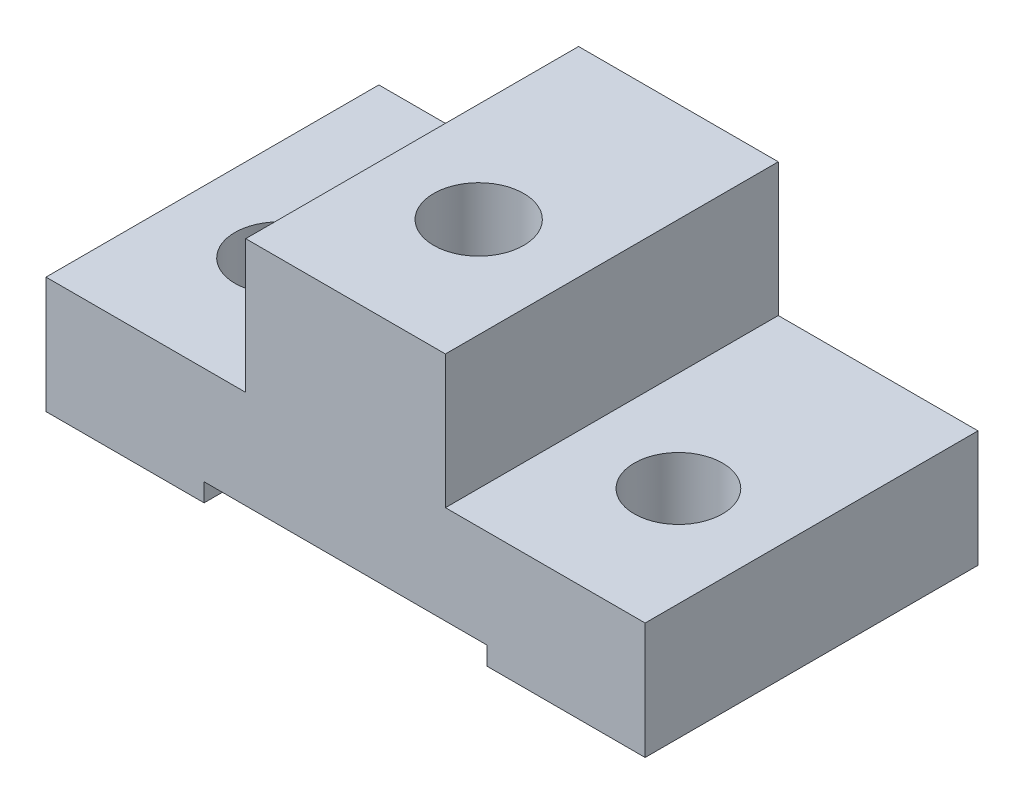
ISO-10303-21;
HEADER;
FILE_DESCRIPTION(('STEP AP214'),'2;1');
FILE_NAME('part.step','',(''),(''),'','','');
FILE_SCHEMA(('AUTOMOTIVE_DESIGN { 1 0 10303 214 1 1 1 1 }'));
ENDSEC;
DATA;
#1=APPLICATION_CONTEXT('core data for automotive mechanical design processes');
#2=APPLICATION_PROTOCOL_DEFINITION('international standard','automotive_design',2000,#1);
#3=PRODUCT_CONTEXT('',#1,'mechanical');
#4=PRODUCT('Part','Part','',(#3));
#5=PRODUCT_RELATED_PRODUCT_CATEGORY('part','',(#4));
#6=PRODUCT_DEFINITION_FORMATION('','',#4);
#7=PRODUCT_DEFINITION_CONTEXT('part definition',#1,'design');
#8=PRODUCT_DEFINITION('design','',#6,#7);
#9=PRODUCT_DEFINITION_SHAPE('','',#8);
#10=(LENGTH_UNIT() NAMED_UNIT(*) SI_UNIT(.MILLI.,.METRE.));
#11=(NAMED_UNIT(*) PLANE_ANGLE_UNIT() SI_UNIT($,.RADIAN.));
#12=(NAMED_UNIT(*) SI_UNIT($,.STERADIAN.) SOLID_ANGLE_UNIT());
#13=UNCERTAINTY_MEASURE_WITH_UNIT(LENGTH_MEASURE(1.E-05),#10,'distance_accuracy_value','');
#14=(GEOMETRIC_REPRESENTATION_CONTEXT(3) GLOBAL_UNCERTAINTY_ASSIGNED_CONTEXT((#13)) GLOBAL_UNIT_ASSIGNED_CONTEXT((#10,
#11,#12)) REPRESENTATION_CONTEXT('',''));
#15=CARTESIAN_POINT('',(0.,0.,0.));
#16=DIRECTION('',(0.,0.,1.));
#17=DIRECTION('',(1.,0.,0.));
#18=AXIS2_PLACEMENT_3D('',#15,#16,#17);
#19=CARTESIAN_POINT('',(0.,0.,0.));
#20=DIRECTION('',(0.,-1.,0.));
#21=DIRECTION('',(0.,0.,-1.));
#22=AXIS2_PLACEMENT_3D('',#19,#20,#21);
#23=PLANE('',#22);
#24=DIRECTION('',(0.,0.,1.));
#25=VECTOR('',#24,1.);
#26=CARTESIAN_POINT('',(-8.5,0.,-10.));
#27=LINE('',#26,#25);
#28=CARTESIAN_POINT('',(-8.5,0.,-10.));
#29=VERTEX_POINT('',#28);
#30=CARTESIAN_POINT('',(-8.5,0.,10.));
#31=VERTEX_POINT('',#30);
#32=EDGE_CURVE('E179',#29,#31,#27,.T.);
#33=ORIENTED_EDGE('',*,*,#32,.T.);
#34=DIRECTION('',(1.,0.,0.));
#35=VECTOR('',#34,1.);
#36=CARTESIAN_POINT('',(-18.,0.,10.));
#37=LINE('',#36,#35);
#38=CARTESIAN_POINT('',(-18.,0.,10.));
#39=VERTEX_POINT('',#38);
#40=EDGE_CURVE('E240',#39,#31,#37,.T.);
#41=ORIENTED_EDGE('',*,*,#40,.F.);
#42=DIRECTION('',(0.,0.,1.));
#43=VECTOR('',#42,1.);
#44=CARTESIAN_POINT('',(-18.,0.,10.));
#45=LINE('',#44,#43);
#46=CARTESIAN_POINT('',(-18.,0.,-10.));
#47=VERTEX_POINT('',#46);
#48=EDGE_CURVE('E249',#47,#39,#45,.T.);
#49=ORIENTED_EDGE('',*,*,#48,.F.);
#50=DIRECTION('',(-1.,0.,0.));
#51=VECTOR('',#50,1.);
#52=CARTESIAN_POINT('',(-18.,0.,-10.));
#53=LINE('',#52,#51);
#54=EDGE_CURVE('E245',#29,#47,#53,.T.);
#55=ORIENTED_EDGE('',*,*,#54,.F.);
#56=EDGE_LOOP('',(#33,#41,#49,#55));
#57=FACE_BOUND('',#56,.T.);
#58=CARTESIAN_POINT('',(-12.,0.,2.));
#59=DIRECTION('',(0.,1.,0.));
#60=DIRECTION('',(0.,0.,1.));
#61=AXIS2_PLACEMENT_3D('',#58,#59,#60);
#62=CIRCLE('',#61,2.65);
#63=CARTESIAN_POINT('',(-12.,0.,4.65));
#64=VERTEX_POINT('',#63);
#65=EDGE_CURVE('E232',#64,#64,#62,.T.);
#66=ORIENTED_EDGE('',*,*,#65,.T.);
#67=EDGE_LOOP('',(#66));
#68=FACE_BOUND('',#67,.T.);
#69=ADVANCED_FACE('F37',(#57,#68),#23,.T.);
#70=CARTESIAN_POINT('',(-18.,15.,-10.));
#71=DIRECTION('',(0.,0.,1.));
#72=DIRECTION('',(1.,0.,0.));
#73=AXIS2_PLACEMENT_3D('',#70,#71,#72);
#74=PLANE('',#73);
#75=CARTESIAN_POINT('',(0.,4.7,-10.));
#76=DIRECTION('',(0.,0.,-1.));
#77=DIRECTION('',(-1.,0.,0.));
#78=AXIS2_PLACEMENT_3D('',#75,#76,#77);
#79=CIRCLE('',#78,2.70509999999999);
#80=CARTESIAN_POINT('',(-2.70509999999999,4.7,-10.));
#81=VERTEX_POINT('',#80);
#82=EDGE_CURVE('E279',#81,#81,#79,.T.);
#83=ORIENTED_EDGE('',*,*,#82,.F.);
#84=EDGE_LOOP('',(#83));
#85=FACE_BOUND('',#84,.T.);
#86=DIRECTION('',(-1.,0.,0.));
#87=VECTOR('',#86,1.);
#88=CARTESIAN_POINT('',(-8.5,0.5,-10.));
#89=LINE('',#88,#87);
#90=CARTESIAN_POINT('',(8.5,0.5,-10.));
#91=VERTEX_POINT('',#90);
#92=CARTESIAN_POINT('',(-8.5,0.5,-10.));
#93=VERTEX_POINT('',#92);
#94=EDGE_CURVE('E176',#91,#93,#89,.T.);
#95=ORIENTED_EDGE('',*,*,#94,.T.);
#96=DIRECTION('',(0.,-1.,0.));
#97=VECTOR('',#96,1.);
#98=CARTESIAN_POINT('',(-8.5,0.,-10.));
#99=LINE('',#98,#97);
#100=EDGE_CURVE('E171',#93,#29,#99,.T.);
#101=ORIENTED_EDGE('',*,*,#100,.T.);
#102=ORIENTED_EDGE('',*,*,#54,.T.);
#103=DIRECTION('',(0.,-1.,0.));
#104=VECTOR('',#103,1.);
#105=CARTESIAN_POINT('',(-18.,15.,-10.));
#106=LINE('',#105,#104);
#107=CARTESIAN_POINT('',(-18.,7.,-10.));
#108=VERTEX_POINT('',#107);
#109=EDGE_CURVE('E46',#108,#47,#106,.T.);
#110=ORIENTED_EDGE('',*,*,#109,.F.);
#111=DIRECTION('',(1.,0.,0.));
#112=VECTOR('',#111,1.);
#113=CARTESIAN_POINT('',(-18.,7.,-10.));
#114=LINE('',#113,#112);
#115=CARTESIAN_POINT('',(-6.,7.,-10.));
#116=VERTEX_POINT('',#115);
#117=EDGE_CURVE('E197',#108,#116,#114,.T.);
#118=ORIENTED_EDGE('',*,*,#117,.T.);
#119=DIRECTION('',(0.,-1.,0.));
#120=VECTOR('',#119,1.);
#121=CARTESIAN_POINT('',(-6.,15.,-10.));
#122=LINE('',#121,#120);
#123=CARTESIAN_POINT('',(-6.,15.,-10.));
#124=VERTEX_POINT('',#123);
#125=EDGE_CURVE('E202',#124,#116,#122,.T.);
#126=ORIENTED_EDGE('',*,*,#125,.F.);
#127=DIRECTION('',(-1.,0.,0.));
#128=VECTOR('',#127,1.);
#129=CARTESIAN_POINT('',(-18.,15.,-10.));
#130=LINE('',#129,#128);
#131=CARTESIAN_POINT('',(6.,15.,-10.));
#132=VERTEX_POINT('',#131);
#133=EDGE_CURVE('E236',#132,#124,#130,.T.);
#134=ORIENTED_EDGE('',*,*,#133,.F.);
#135=DIRECTION('',(0.,-1.,0.));
#136=VECTOR('',#135,1.);
#137=CARTESIAN_POINT('',(6.,15.,-10.));
#138=LINE('',#137,#136);
#139=CARTESIAN_POINT('',(6.,7.,-10.));
#140=VERTEX_POINT('',#139);
#141=EDGE_CURVE('E211',#132,#140,#138,.T.);
#142=ORIENTED_EDGE('',*,*,#141,.T.);
#143=DIRECTION('',(-1.,0.,0.));
#144=VECTOR('',#143,1.);
#145=CARTESIAN_POINT('',(18.,7.,-10.));
#146=LINE('',#145,#144);
#147=CARTESIAN_POINT('',(18.,7.,-10.));
#148=VERTEX_POINT('',#147);
#149=EDGE_CURVE('E209',#148,#140,#146,.T.);
#150=ORIENTED_EDGE('',*,*,#149,.F.);
#151=DIRECTION('',(0.,-1.,0.));
#152=VECTOR('',#151,1.);
#153=CARTESIAN_POINT('',(18.,15.,-10.));
#154=LINE('',#153,#152);
#155=CARTESIAN_POINT('',(18.,0.,-10.));
#156=VERTEX_POINT('',#155);
#157=EDGE_CURVE('E11',#148,#156,#154,.T.);
#158=ORIENTED_EDGE('',*,*,#157,.T.);
#159=CARTESIAN_POINT('',(8.5,0.,-10.));
#160=VERTEX_POINT('',#159);
#161=EDGE_CURVE('E246',#156,#160,#53,.T.);
#162=ORIENTED_EDGE('',*,*,#161,.T.);
#163=DIRECTION('',(0.,1.,0.));
#164=VECTOR('',#163,1.);
#165=CARTESIAN_POINT('',(8.5,0.,-10.));
#166=LINE('',#165,#164);
#167=EDGE_CURVE('E62',#160,#91,#166,.T.);
#168=ORIENTED_EDGE('',*,*,#167,.T.);
#169=EDGE_LOOP('',(#95,#101,#102,#110,#118,#126,#134,#142,#150,#158,#162,#168));
#170=FACE_BOUND('',#169,.T.);
#171=ADVANCED_FACE('F315',(#85,#170),#74,.F.);
#172=CARTESIAN_POINT('',(-18.,15.,10.));
#173=DIRECTION('',(0.,0.,-1.));
#174=DIRECTION('',(-1.,0.,0.));
#175=AXIS2_PLACEMENT_3D('',#172,#173,#174);
#176=PLANE('',#175);
#177=DIRECTION('',(0.,-1.,0.));
#178=VECTOR('',#177,1.);
#179=CARTESIAN_POINT('',(-8.5,0.,10.));
#180=LINE('',#179,#178);
#181=CARTESIAN_POINT('',(-8.5,1.1,10.));
#182=VERTEX_POINT('',#181);
#183=EDGE_CURVE('E169',#182,#31,#180,.T.);
#184=ORIENTED_EDGE('',*,*,#183,.F.);
#185=DIRECTION('',(-1.,0.,0.));
#186=VECTOR('',#185,1.);
#187=CARTESIAN_POINT('',(-8.5,1.1,10.));
#188=LINE('',#187,#186);
#189=CARTESIAN_POINT('',(8.5,1.1,10.));
#190=VERTEX_POINT('',#189);
#191=EDGE_CURVE('E148',#190,#182,#188,.T.);
#192=ORIENTED_EDGE('',*,*,#191,.F.);
#193=DIRECTION('',(0.,1.,0.));
#194=VECTOR('',#193,1.);
#195=CARTESIAN_POINT('',(8.5,0.,10.));
#196=LINE('',#195,#194);
#197=CARTESIAN_POINT('',(8.5,0.,10.));
#198=VERTEX_POINT('',#197);
#199=EDGE_CURVE('E174',#198,#190,#196,.T.);
#200=ORIENTED_EDGE('',*,*,#199,.F.);
#201=CARTESIAN_POINT('',(18.,0.,10.));
#202=VERTEX_POINT('',#201);
#203=EDGE_CURVE('E252',#198,#202,#37,.T.);
#204=ORIENTED_EDGE('',*,*,#203,.T.);
#205=DIRECTION('',(0.,-1.,0.));
#206=VECTOR('',#205,1.);
#207=CARTESIAN_POINT('',(18.,15.,10.));
#208=LINE('',#207,#206);
#209=CARTESIAN_POINT('',(18.,7.,10.));
#210=VERTEX_POINT('',#209);
#211=EDGE_CURVE('E242',#210,#202,#208,.T.);
#212=ORIENTED_EDGE('',*,*,#211,.F.);
#213=DIRECTION('',(-1.,0.,0.));
#214=VECTOR('',#213,1.);
#215=CARTESIAN_POINT('',(18.,7.,10.));
#216=LINE('',#215,#214);
#217=CARTESIAN_POINT('',(6.,7.,10.));
#218=VERTEX_POINT('',#217);
#219=EDGE_CURVE('E216',#210,#218,#216,.T.);
#220=ORIENTED_EDGE('',*,*,#219,.T.);
#221=DIRECTION('',(0.,-1.,0.));
#222=VECTOR('',#221,1.);
#223=CARTESIAN_POINT('',(6.,15.,10.));
#224=LINE('',#223,#222);
#225=CARTESIAN_POINT('',(6.,15.,10.));
#226=VERTEX_POINT('',#225);
#227=EDGE_CURVE('E212',#226,#218,#224,.T.);
#228=ORIENTED_EDGE('',*,*,#227,.F.);
#229=DIRECTION('',(1.,0.,0.));
#230=VECTOR('',#229,1.);
#231=CARTESIAN_POINT('',(-18.,15.,10.));
#232=LINE('',#231,#230);
#233=CARTESIAN_POINT('',(-6.,15.,10.));
#234=VERTEX_POINT('',#233);
#235=EDGE_CURVE('E239',#234,#226,#232,.T.);
#236=ORIENTED_EDGE('',*,*,#235,.F.);
#237=DIRECTION('',(0.,-1.,0.));
#238=VECTOR('',#237,1.);
#239=CARTESIAN_POINT('',(-6.,15.,10.));
#240=LINE('',#239,#238);
#241=CARTESIAN_POINT('',(-6.,7.,10.));
#242=VERTEX_POINT('',#241);
#243=EDGE_CURVE('E201',#234,#242,#240,.T.);
#244=ORIENTED_EDGE('',*,*,#243,.T.);
#245=DIRECTION('',(1.,0.,0.));
#246=VECTOR('',#245,1.);
#247=CARTESIAN_POINT('',(-18.,7.,10.));
#248=LINE('',#247,#246);
#249=CARTESIAN_POINT('',(-18.,7.,10.));
#250=VERTEX_POINT('',#249);
#251=EDGE_CURVE('E198',#250,#242,#248,.T.);
#252=ORIENTED_EDGE('',*,*,#251,.F.);
#253=DIRECTION('',(0.,-1.,0.));
#254=VECTOR('',#253,1.);
#255=CARTESIAN_POINT('',(-18.,15.,10.));
#256=LINE('',#255,#254);
#257=EDGE_CURVE('E257',#250,#39,#256,.T.);
#258=ORIENTED_EDGE('',*,*,#257,.T.);
#259=ORIENTED_EDGE('',*,*,#40,.T.);
#260=EDGE_LOOP('',(#184,#192,#200,#204,#212,#220,#228,#236,#244,#252,#258,#259));
#261=FACE_BOUND('',#260,.T.);
#262=ADVANCED_FACE('F306',(#261),#176,.F.);
#263=CARTESIAN_POINT('',(0.,15.,0.));
#264=DIRECTION('',(0.,-1.,0.));
#265=DIRECTION('',(0.,0.,-1.));
#266=AXIS2_PLACEMENT_3D('',#263,#264,#265);
#267=PLANE('',#266);
#268=CARTESIAN_POINT('',(0.,15.,2.));
#269=DIRECTION('',(0.,1.,0.));
#270=DIRECTION('',(0.,0.,1.));
#271=AXIS2_PLACEMENT_3D('',#268,#269,#270);
#272=CIRCLE('',#271,2.7051);
#273=CARTESIAN_POINT('',(0.,15.,4.7051));
#274=VERTEX_POINT('',#273);
#275=EDGE_CURVE('E266',#274,#274,#272,.T.);
#276=ORIENTED_EDGE('',*,*,#275,.F.);
#277=EDGE_LOOP('',(#276));
#278=FACE_BOUND('',#277,.T.);
#279=DIRECTION('',(0.,0.,1.));
#280=VECTOR('',#279,1.);
#281=CARTESIAN_POINT('',(-6.,15.,-10.));
#282=LINE('',#281,#280);
#283=EDGE_CURVE('E183',#124,#234,#282,.T.);
#284=ORIENTED_EDGE('',*,*,#283,.T.);
#285=ORIENTED_EDGE('',*,*,#235,.T.);
#286=DIRECTION('',(0.,0.,1.));
#287=VECTOR('',#286,1.);
#288=CARTESIAN_POINT('',(6.,15.,-10.));
#289=LINE('',#288,#287);
#290=EDGE_CURVE('E215',#132,#226,#289,.T.);
#291=ORIENTED_EDGE('',*,*,#290,.F.);
#292=ORIENTED_EDGE('',*,*,#133,.T.);
#293=EDGE_LOOP('',(#284,#285,#291,#292));
#294=FACE_BOUND('',#293,.T.);
#295=ADVANCED_FACE('F331',(#278,#294),#267,.F.);
#296=CARTESIAN_POINT('',(18.,15.,10.));
#297=DIRECTION('',(-1.,0.,0.));
#298=DIRECTION('',(0.,0.,1.));
#299=AXIS2_PLACEMENT_3D('',#296,#297,#298);
#300=PLANE('',#299);
#301=DIRECTION('',(0.,0.,1.));
#302=VECTOR('',#301,1.);
#303=CARTESIAN_POINT('',(18.,7.,-10.));
#304=LINE('',#303,#302);
#305=EDGE_CURVE('E225',#148,#210,#304,.T.);
#306=ORIENTED_EDGE('',*,*,#305,.T.);
#307=ORIENTED_EDGE('',*,*,#211,.T.);
#308=DIRECTION('',(0.,0.,-1.));
#309=VECTOR('',#308,1.);
#310=CARTESIAN_POINT('',(18.,0.,10.));
#311=LINE('',#310,#309);
#312=EDGE_CURVE('E235',#202,#156,#311,.T.);
#313=ORIENTED_EDGE('',*,*,#312,.T.);
#314=ORIENTED_EDGE('',*,*,#157,.F.);
#315=EDGE_LOOP('',(#306,#307,#313,#314));
#316=FACE_BOUND('',#315,.T.);
#317=ADVANCED_FACE('F39',(#316),#300,.F.);
#318=CARTESIAN_POINT('',(12.,0.,2.));
#319=DIRECTION('',(0.,1.,0.));
#320=DIRECTION('',(0.,0.,1.));
#321=AXIS2_PLACEMENT_3D('',#318,#319,#320);
#322=CYLINDRICAL_SURFACE('',#321,2.65);
#323=CARTESIAN_POINT('',(12.,0.,2.));
#324=DIRECTION('',(0.,1.,0.));
#325=DIRECTION('',(0.,0.,1.));
#326=AXIS2_PLACEMENT_3D('',#323,#324,#325);
#327=CIRCLE('',#326,2.65);
#328=CARTESIAN_POINT('',(12.,0.,4.65));
#329=VERTEX_POINT('',#328);
#330=EDGE_CURVE('E229',#329,#329,#327,.T.);
#331=ORIENTED_EDGE('',*,*,#330,.F.);
#332=EDGE_LOOP('',(#331));
#333=FACE_BOUND('',#332,.T.);
#334=CARTESIAN_POINT('',(12.,7.,2.));
#335=DIRECTION('',(0.,1.,0.));
#336=DIRECTION('',(-1.,0.,0.));
#337=AXIS2_PLACEMENT_3D('',#334,#335,#336);
#338=CIRCLE('',#337,2.65);
#339=CARTESIAN_POINT('',(9.35,7.,2.));
#340=VERTEX_POINT('',#339);
#341=EDGE_CURVE('E228',#340,#340,#338,.F.);
#342=ORIENTED_EDGE('',*,*,#341,.F.);
#343=EDGE_LOOP('',(#342));
#344=FACE_BOUND('',#343,.T.);
#345=ADVANCED_FACE('F354',(#333,#344),#322,.F.);
#346=CARTESIAN_POINT('',(-18.,15.,10.));
#347=DIRECTION('',(1.,0.,0.));
#348=DIRECTION('',(0.,0.,-1.));
#349=AXIS2_PLACEMENT_3D('',#346,#347,#348);
#350=PLANE('',#349);
#351=ORIENTED_EDGE('',*,*,#257,.F.);
#352=DIRECTION('',(0.,0.,1.));
#353=VECTOR('',#352,1.);
#354=CARTESIAN_POINT('',(-18.,7.,-10.));
#355=LINE('',#354,#353);
#356=EDGE_CURVE('E195',#108,#250,#355,.T.);
#357=ORIENTED_EDGE('',*,*,#356,.F.);
#358=ORIENTED_EDGE('',*,*,#109,.T.);
#359=ORIENTED_EDGE('',*,*,#48,.T.);
#360=EDGE_LOOP('',(#351,#357,#358,#359));
#361=FACE_BOUND('',#360,.T.);
#362=ADVANCED_FACE('F319',(#361),#350,.F.);
#363=DIRECTION('',(0.,0.,1.));
#364=VECTOR('',#363,1.);
#365=CARTESIAN_POINT('',(8.5,0.,-10.));
#366=LINE('',#365,#364);
#367=EDGE_CURVE('E187',#160,#198,#366,.T.);
#368=ORIENTED_EDGE('',*,*,#367,.F.);
#369=ORIENTED_EDGE('',*,*,#161,.F.);
#370=ORIENTED_EDGE('',*,*,#312,.F.);
#371=ORIENTED_EDGE('',*,*,#203,.F.);
#372=EDGE_LOOP('',(#368,#369,#370,#371));
#373=FACE_BOUND('',#372,.T.);
#374=ORIENTED_EDGE('',*,*,#330,.T.);
#375=EDGE_LOOP('',(#374));
#376=FACE_BOUND('',#375,.T.);
#377=ADVANCED_FACE('F346',(#373,#376),#23,.T.);
#378=CARTESIAN_POINT('',(-12.,0.,2.));
#379=DIRECTION('',(0.,1.,0.));
#380=DIRECTION('',(0.,0.,1.));
#381=AXIS2_PLACEMENT_3D('',#378,#379,#380);
#382=CYLINDRICAL_SURFACE('',#381,2.65);
#383=CARTESIAN_POINT('',(-12.,7.,2.));
#384=DIRECTION('',(0.,-1.,0.));
#385=DIRECTION('',(1.,0.,0.));
#386=AXIS2_PLACEMENT_3D('',#383,#384,#385);
#387=CIRCLE('',#386,2.65);
#388=CARTESIAN_POINT('',(-9.35,7.,2.));
#389=VERTEX_POINT('',#388);
#390=EDGE_CURVE('E205',#389,#389,#387,.F.);
#391=ORIENTED_EDGE('',*,*,#390,.T.);
#392=EDGE_LOOP('',(#391));
#393=FACE_BOUND('',#392,.T.);
#394=ORIENTED_EDGE('',*,*,#65,.F.);
#395=EDGE_LOOP('',(#394));
#396=FACE_BOUND('',#395,.T.);
#397=ADVANCED_FACE('F350',(#393,#396),#382,.F.);
#398=CARTESIAN_POINT('',(18.,7.,-10.));
#399=DIRECTION('',(0.,1.,0.));
#400=DIRECTION('',(-1.,0.,0.));
#401=AXIS2_PLACEMENT_3D('',#398,#399,#400);
#402=PLANE('',#401);
#403=ORIENTED_EDGE('',*,*,#219,.F.);
#404=ORIENTED_EDGE('',*,*,#305,.F.);
#405=ORIENTED_EDGE('',*,*,#149,.T.);
#406=DIRECTION('',(0.,0.,1.));
#407=VECTOR('',#406,1.);
#408=CARTESIAN_POINT('',(6.,7.,-10.));
#409=LINE('',#408,#407);
#410=EDGE_CURVE('E223',#140,#218,#409,.T.);
#411=ORIENTED_EDGE('',*,*,#410,.T.);
#412=EDGE_LOOP('',(#403,#404,#405,#411));
#413=FACE_BOUND('',#412,.T.);
#414=ORIENTED_EDGE('',*,*,#341,.T.);
#415=EDGE_LOOP('',(#414));
#416=FACE_BOUND('',#415,.T.);
#417=ADVANCED_FACE('F340',(#413,#416),#402,.T.);
#418=CARTESIAN_POINT('',(6.,15.,-10.));
#419=DIRECTION('',(-1.,0.,0.));
#420=DIRECTION('',(0.,0.,1.));
#421=AXIS2_PLACEMENT_3D('',#418,#419,#420);
#422=PLANE('',#421);
#423=ORIENTED_EDGE('',*,*,#227,.T.);
#424=ORIENTED_EDGE('',*,*,#410,.F.);
#425=ORIENTED_EDGE('',*,*,#141,.F.);
#426=ORIENTED_EDGE('',*,*,#290,.T.);
#427=EDGE_LOOP('',(#423,#424,#425,#426));
#428=FACE_BOUND('',#427,.T.);
#429=ADVANCED_FACE('F338',(#428),#422,.F.);
#430=CARTESIAN_POINT('',(-18.,7.,-10.));
#431=DIRECTION('',(0.,-1.,0.));
#432=DIRECTION('',(1.,0.,0.));
#433=AXIS2_PLACEMENT_3D('',#430,#431,#432);
#434=PLANE('',#433);
#435=ORIENTED_EDGE('',*,*,#251,.T.);
#436=DIRECTION('',(0.,0.,1.));
#437=VECTOR('',#436,1.);
#438=CARTESIAN_POINT('',(-6.,7.,-10.));
#439=LINE('',#438,#437);
#440=EDGE_CURVE('E193',#116,#242,#439,.T.);
#441=ORIENTED_EDGE('',*,*,#440,.F.);
#442=ORIENTED_EDGE('',*,*,#117,.F.);
#443=ORIENTED_EDGE('',*,*,#356,.T.);
#444=EDGE_LOOP('',(#435,#441,#442,#443));
#445=FACE_BOUND('',#444,.T.);
#446=ORIENTED_EDGE('',*,*,#390,.F.);
#447=EDGE_LOOP('',(#446));
#448=FACE_BOUND('',#447,.T.);
#449=ADVANCED_FACE('F322',(#445,#448),#434,.F.);
#450=CARTESIAN_POINT('',(-6.,15.,-10.));
#451=DIRECTION('',(-1.,0.,0.));
#452=DIRECTION('',(0.,0.,1.));
#453=AXIS2_PLACEMENT_3D('',#450,#451,#452);
#454=PLANE('',#453);
#455=ORIENTED_EDGE('',*,*,#243,.F.);
#456=ORIENTED_EDGE('',*,*,#283,.F.);
#457=ORIENTED_EDGE('',*,*,#125,.T.);
#458=ORIENTED_EDGE('',*,*,#440,.T.);
#459=EDGE_LOOP('',(#455,#456,#457,#458));
#460=FACE_BOUND('',#459,.T.);
#461=ADVANCED_FACE('F328',(#460),#454,.T.);
#462=CARTESIAN_POINT('',(-8.5,0.,-10.));
#463=DIRECTION('',(-1.,0.,0.));
#464=DIRECTION('',(0.,0.,1.));
#465=AXIS2_PLACEMENT_3D('',#462,#463,#464);
#466=PLANE('',#465);
#467=ORIENTED_EDGE('',*,*,#183,.T.);
#468=ORIENTED_EDGE('',*,*,#32,.F.);
#469=ORIENTED_EDGE('',*,*,#100,.F.);
#470=DIRECTION('',(0.,0.,1.));
#471=VECTOR('',#470,1.);
#472=CARTESIAN_POINT('',(-8.5,0.5,-10.));
#473=LINE('',#472,#471);
#474=CARTESIAN_POINT('',(-8.5,0.5,8.));
#475=VERTEX_POINT('',#474);
#476=EDGE_CURVE('E146',#93,#475,#473,.T.);
#477=ORIENTED_EDGE('',*,*,#476,.T.);
#478=DIRECTION('',(0.,-1.,0.));
#479=VECTOR('',#478,1.);
#480=CARTESIAN_POINT('',(-8.5,1.1,8.));
#481=LINE('',#480,#479);
#482=CARTESIAN_POINT('',(-8.5,1.1,8.));
#483=VERTEX_POINT('',#482);
#484=EDGE_CURVE('E139',#483,#475,#481,.T.);
#485=ORIENTED_EDGE('',*,*,#484,.F.);
#486=DIRECTION('',(0.,0.,-1.));
#487=VECTOR('',#486,1.);
#488=CARTESIAN_POINT('',(-8.5,1.1,10.));
#489=LINE('',#488,#487);
#490=EDGE_CURVE('E143',#182,#483,#489,.T.);
#491=ORIENTED_EDGE('',*,*,#490,.F.);
#492=EDGE_LOOP('',(#467,#468,#469,#477,#485,#491));
#493=FACE_BOUND('',#492,.T.);
#494=ADVANCED_FACE('F141',(#493),#466,.F.);
#495=CARTESIAN_POINT('',(-8.5,0.5,-10.));
#496=DIRECTION('',(0.,1.,0.));
#497=DIRECTION('',(0.,0.,1.));
#498=AXIS2_PLACEMENT_3D('',#495,#496,#497);
#499=PLANE('',#498);
#500=CARTESIAN_POINT('',(0.,0.5,2.));
#501=DIRECTION('',(0.,-1.,0.));
#502=DIRECTION('',(0.,0.,-1.));
#503=AXIS2_PLACEMENT_3D('',#500,#501,#502);
#504=CIRCLE('',#503,4.9);
#505=CARTESIAN_POINT('',(0.,0.5,-2.9));
#506=VERTEX_POINT('',#505);
#507=EDGE_CURVE('E164',#506,#506,#504,.T.);
#508=ORIENTED_EDGE('',*,*,#507,.F.);
#509=EDGE_LOOP('',(#508));
#510=FACE_BOUND('',#509,.T.);
#511=DIRECTION('',(0.,0.,1.));
#512=VECTOR('',#511,1.);
#513=CARTESIAN_POINT('',(8.5,0.5,-10.));
#514=LINE('',#513,#512);
#515=CARTESIAN_POINT('',(8.5,0.5,8.));
#516=VERTEX_POINT('',#515);
#517=EDGE_CURVE('E184',#91,#516,#514,.T.);
#518=ORIENTED_EDGE('',*,*,#517,.T.);
#519=DIRECTION('',(1.,0.,0.));
#520=VECTOR('',#519,1.);
#521=CARTESIAN_POINT('',(-8.5,0.5,8.));
#522=LINE('',#521,#520);
#523=EDGE_CURVE('E54',#475,#516,#522,.T.);
#524=ORIENTED_EDGE('',*,*,#523,.F.);
#525=ORIENTED_EDGE('',*,*,#476,.F.);
#526=ORIENTED_EDGE('',*,*,#94,.F.);
#527=EDGE_LOOP('',(#518,#524,#525,#526));
#528=FACE_BOUND('',#527,.T.);
#529=ADVANCED_FACE('F298',(#510,#528),#499,.F.);
#530=CARTESIAN_POINT('',(8.5,0.,-10.));
#531=DIRECTION('',(1.,0.,0.));
#532=DIRECTION('',(0.,0.,-1.));
#533=AXIS2_PLACEMENT_3D('',#530,#531,#532);
#534=PLANE('',#533);
#535=ORIENTED_EDGE('',*,*,#199,.T.);
#536=DIRECTION('',(0.,0.,1.));
#537=VECTOR('',#536,1.);
#538=CARTESIAN_POINT('',(8.5,1.1,10.));
#539=LINE('',#538,#537);
#540=CARTESIAN_POINT('',(8.5,1.1,8.));
#541=VERTEX_POINT('',#540);
#542=EDGE_CURVE('E156',#541,#190,#539,.T.);
#543=ORIENTED_EDGE('',*,*,#542,.F.);
#544=DIRECTION('',(0.,-1.,0.));
#545=VECTOR('',#544,1.);
#546=CARTESIAN_POINT('',(8.5,1.1,8.));
#547=LINE('',#546,#545);
#548=EDGE_CURVE('E147',#541,#516,#547,.T.);
#549=ORIENTED_EDGE('',*,*,#548,.T.);
#550=ORIENTED_EDGE('',*,*,#517,.F.);
#551=ORIENTED_EDGE('',*,*,#167,.F.);
#552=ORIENTED_EDGE('',*,*,#367,.T.);
#553=EDGE_LOOP('',(#535,#543,#549,#550,#551,#552));
#554=FACE_BOUND('',#553,.T.);
#555=ADVANCED_FACE('F301',(#554),#534,.F.);
#556=CARTESIAN_POINT('',(-8.5,1.1,8.));
#557=DIRECTION('',(0.,0.,-1.));
#558=DIRECTION('',(-1.,0.,0.));
#559=AXIS2_PLACEMENT_3D('',#556,#557,#558);
#560=PLANE('',#559);
#561=ORIENTED_EDGE('',*,*,#523,.T.);
#562=ORIENTED_EDGE('',*,*,#548,.F.);
#563=DIRECTION('',(1.,0.,0.));
#564=VECTOR('',#563,1.);
#565=CARTESIAN_POINT('',(-8.5,1.1,8.));
#566=LINE('',#565,#564);
#567=EDGE_CURVE('E151',#483,#541,#566,.T.);
#568=ORIENTED_EDGE('',*,*,#567,.F.);
#569=ORIENTED_EDGE('',*,*,#484,.T.);
#570=EDGE_LOOP('',(#561,#562,#568,#569));
#571=FACE_BOUND('',#570,.T.);
#572=ADVANCED_FACE('F152',(#571),#560,.F.);
#573=CARTESIAN_POINT('',(0.,1.1,0.));
#574=DIRECTION('',(0.,-1.,0.));
#575=DIRECTION('',(0.,0.,-1.));
#576=AXIS2_PLACEMENT_3D('',#573,#574,#575);
#577=PLANE('',#576);
#578=ORIENTED_EDGE('',*,*,#490,.T.);
#579=ORIENTED_EDGE('',*,*,#567,.T.);
#580=ORIENTED_EDGE('',*,*,#542,.T.);
#581=ORIENTED_EDGE('',*,*,#191,.T.);
#582=EDGE_LOOP('',(#578,#579,#580,#581));
#583=FACE_BOUND('',#582,.T.);
#584=ADVANCED_FACE('F158',(#583),#577,.T.);
#585=CARTESIAN_POINT('',(0.,1.3,2.));
#586=DIRECTION('',(0.,-1.,0.));
#587=DIRECTION('',(0.,0.,-1.));
#588=AXIS2_PLACEMENT_3D('',#585,#586,#587);
#589=CYLINDRICAL_SURFACE('',#588,4.9);
#590=CARTESIAN_POINT('',(0.,1.3,2.));
#591=DIRECTION('',(0.,-1.,0.));
#592=DIRECTION('',(0.,0.,-1.));
#593=AXIS2_PLACEMENT_3D('',#590,#591,#592);
#594=CIRCLE('',#593,4.9);
#595=CARTESIAN_POINT('',(0.,1.3,-2.9));
#596=VERTEX_POINT('',#595);
#597=EDGE_CURVE('E161',#596,#596,#594,.T.);
#598=ORIENTED_EDGE('',*,*,#597,.F.);
#599=EDGE_LOOP('',(#598));
#600=FACE_BOUND('',#599,.T.);
#601=ORIENTED_EDGE('',*,*,#507,.T.);
#602=EDGE_LOOP('',(#601));
#603=FACE_BOUND('',#602,.T.);
#604=ADVANCED_FACE('F296',(#600,#603),#589,.F.);
#605=CARTESIAN_POINT('',(0.,1.3,2.));
#606=DIRECTION('',(0.,-1.,0.));
#607=DIRECTION('',(0.,0.,-1.));
#608=AXIS2_PLACEMENT_3D('',#605,#606,#607);
#609=PLANE('',#608);
#610=CARTESIAN_POINT('',(0.,1.3,2.));
#611=DIRECTION('',(0.,-1.,0.));
#612=DIRECTION('',(0.,0.,-1.));
#613=AXIS2_PLACEMENT_3D('',#610,#611,#612);
#614=CIRCLE('',#613,4.);
#615=CARTESIAN_POINT('',(0.,1.3,-2.));
#616=VERTEX_POINT('',#615);
#617=EDGE_CURVE('E285',#616,#616,#614,.T.);
#618=ORIENTED_EDGE('',*,*,#617,.F.);
#619=EDGE_LOOP('',(#618));
#620=FACE_BOUND('',#619,.T.);
#621=ORIENTED_EDGE('',*,*,#597,.T.);
#622=EDGE_LOOP('',(#621));
#623=FACE_BOUND('',#622,.T.);
#624=ADVANCED_FACE('F472',(#620,#623),#609,.T.);
#625=CARTESIAN_POINT('',(0.,6.3,2.));
#626=DIRECTION('',(0.,-1.,0.));
#627=DIRECTION('',(0.,0.,-1.));
#628=AXIS2_PLACEMENT_3D('',#625,#626,#627);
#629=CYLINDRICAL_SURFACE('',#628,4.);
#630=CARTESIAN_POINT('',(0.,5.2,-2.));
#631=CARTESIAN_POINT('',(0.0279682191111575,5.19999881181286,-1.99999960979286));
#632=CARTESIAN_POINT('',(0.0559539148605546,5.19764542416614,-1.9997035691098));
#633=CARTESIAN_POINT('',(0.111146560417956,5.18829444908584,-1.99855108022272));
#634=CARTESIAN_POINT('',(0.138352666124754,5.18129201241532,-1.99769404688286));
#635=CARTESIAN_POINT('',(0.191179114962616,5.16285247121718,-1.99551612208881));
#636=CARTESIAN_POINT('',(0.216800512029232,5.15141835163803,-1.99419554291108));
#637=CARTESIAN_POINT('',(0.265755894978611,5.12444654320604,-1.9912374017562));
#638=CARTESIAN_POINT('',(0.289090272311278,5.10890955829385,-1.98959989416823));
#639=CARTESIAN_POINT('',(0.332942563386267,5.07408161003208,-1.98618064261265));
#640=CARTESIAN_POINT('',(0.353446072987429,5.05477257413075,-1.98439822938483));
#641=CARTESIAN_POINT('',(0.390930558711501,5.01298743529267,-1.9808954520195));
#642=CARTESIAN_POINT('',(0.407911355278453,4.99051117101734,-1.97917509104854));
#643=CARTESIAN_POINT('',(0.437922032256789,4.94293600448686,-1.97598461123917));
#644=CARTESIAN_POINT('',(0.450938419188215,4.9178285276864,-1.97451535435582));
#645=CARTESIAN_POINT('',(0.472564615315023,4.86576258961052,-1.97200225691537));
#646=CARTESIAN_POINT('',(0.481174591613043,4.83880419857059,-1.97095840022627));
#647=CARTESIAN_POINT('',(0.493699796004952,4.78395116088264,-1.96942067920723));
#648=CARTESIAN_POINT('',(0.497639342946338,4.75606214845915,-1.96892396687349));
#649=CARTESIAN_POINT('',(0.500787109911443,4.70001474730563,-1.96852805628558));
#650=CARTESIAN_POINT('',(0.49999552020048,4.67185636945374,-1.96862883400302));
#651=CARTESIAN_POINT('',(0.493723447289577,4.61623903455024,-1.9694139107395));
#652=CARTESIAN_POINT('',(0.488269752596935,4.58877700275994,-1.97009487592066));
#653=CARTESIAN_POINT('',(0.472870076636405,4.5351609957562,-1.97195839951526));
#654=CARTESIAN_POINT('',(0.462924004350374,4.50900704705719,-1.97314096809145));
#655=CARTESIAN_POINT('',(0.438793111982323,4.45866640019566,-1.9758782317293));
#656=CARTESIAN_POINT('',(0.42459665074152,4.4344853399502,-1.97743394642289));
#657=CARTESIAN_POINT('',(0.392376293891376,4.38883866111734,-1.9807414228612));
#658=CARTESIAN_POINT('',(0.374352223216147,4.36737316680526,-1.98249319357133));
#659=CARTESIAN_POINT('',(0.334839822150747,4.32761145785545,-1.98601021978085));
#660=CARTESIAN_POINT('',(0.313328401567993,4.3093381816468,-1.98777548477378));
#661=CARTESIAN_POINT('',(0.267531433822774,4.27665822399389,-1.99110926511171));
#662=CARTESIAN_POINT('',(0.24324588026364,4.2622515514656,-1.99267778000301));
#663=CARTESIAN_POINT('',(0.192572334272685,4.23771373590722,-1.99544230443716));
#664=CARTESIAN_POINT('',(0.166183639067532,4.22758402922375,-1.99663818880307));
#665=CARTESIAN_POINT('',(0.1120615880862,4.21190590129535,-1.99852157156012));
#666=CARTESIAN_POINT('',(0.0843282953261221,4.20635726557259,-1.99920909375174));
#667=CARTESIAN_POINT('',(0.0285026327826881,4.20002851514789,-1.99999519282152));
#668=CARTESIAN_POINT('',(0.000413898039709962,4.19921680152719,-2.00009767228527));
#669=CARTESIAN_POINT('',(-0.0554992072995106,4.20230154681119,-1.99971267601086));
#670=CARTESIAN_POINT('',(-0.0833235835129525,4.20619790545032,-1.99922521283643));
#671=CARTESIAN_POINT('',(-0.137824901544315,4.21856194175488,-1.99771753751338));
#672=CARTESIAN_POINT('',(-0.164505314084952,4.22701455268053,-1.99669908162774));
#673=CARTESIAN_POINT('',(-0.216069930971692,4.24823549038259,-1.99424344620039));
#674=CARTESIAN_POINT('',(-0.240954074293073,4.26100396369829,-1.99280625244125));
#675=CARTESIAN_POINT('',(-0.288360904137495,4.2905706275015,-1.98966364582022));
#676=CARTESIAN_POINT('',(-0.310870751988773,4.30738925796113,-1.98795688808502));
#677=CARTESIAN_POINT('',(-0.352759397925273,4.34454989950685,-1.98447028465131));
#678=CARTESIAN_POINT('',(-0.37213807166738,4.36489205045021,-1.98269043605379));
#679=CARTESIAN_POINT('',(-0.407326391763612,4.40866148335144,-1.97924621092517));
#680=CARTESIAN_POINT('',(-0.423115092113595,4.43210566926209,-1.97758254944265));
#681=CARTESIAN_POINT('',(-0.450530577888708,4.48133164897095,-1.9745708220743));
#682=CARTESIAN_POINT('',(-0.46215744674568,4.50711339589531,-1.97322274986205));
#683=CARTESIAN_POINT('',(-0.480885315773314,4.56021506382953,-1.97099970078599));
#684=CARTESIAN_POINT('',(-0.487998125491427,4.5875307660096,-1.97012349036958));
#685=CARTESIAN_POINT('',(-0.497533998773574,4.64298049675614,-1.96893983181491));
#686=CARTESIAN_POINT('',(-0.499957280507156,4.67111448719181,-1.96863235721755));
#687=CARTESIAN_POINT('',(-0.50004130721697,4.72719378584095,-1.96862175396491));
#688=CARTESIAN_POINT('',(-0.497734959539857,4.75513904966639,-1.96891444950391));
#689=CARTESIAN_POINT('',(-0.488494880969867,4.81024142586903,-1.9700622290744));
#690=CARTESIAN_POINT('',(-0.481561149581155,4.83739853816177,-1.97091731316616));
#691=CARTESIAN_POINT('',(-0.463273414737931,4.89014939135329,-1.9730922315491));
#692=CARTESIAN_POINT('',(-0.451920996194187,4.91574368900437,-1.97441189918557));
#693=CARTESIAN_POINT('',(-0.425121380430061,4.96466933080967,-1.97736756648964));
#694=CARTESIAN_POINT('',(-0.409674131901916,4.98800064660397,-1.97900357012082));
#695=CARTESIAN_POINT('',(-0.375001266253166,5.0319062450681,-1.98242120950447));
#696=CARTESIAN_POINT('',(-0.355751125154989,5.052461092191,-1.98420374416807));
#697=CARTESIAN_POINT('',(-0.314070045393674,5.0900613650336,-1.9877056631858));
#698=CARTESIAN_POINT('',(-0.29163835782831,5.10710596215487,-1.98942503255118));
#699=CARTESIAN_POINT('',(-0.244133124170838,5.13725707142106,-1.99261411317349));
#700=CARTESIAN_POINT('',(-0.21904985591923,5.15034836117986,-1.9940828501566));
#701=CARTESIAN_POINT('',(-0.167036580460252,5.17211424858326,-1.99659529815345));
#702=CARTESIAN_POINT('',(-0.140108616174043,5.1807936452707,-1.99763947073915));
#703=CARTESIAN_POINT('',(-0.0942011543935803,5.19141186763426,-1.99893344065549));
#704=CARTESIAN_POINT('',(-0.0755111327033795,5.19462778839642,-1.99933145179091));
#705=CARTESIAN_POINT('',(-0.0378834126424821,5.19892224913865,-1.99986486265838));
#706=CARTESIAN_POINT('',(-0.0189457160992004,5.20000080487986,-2.00000026432694));
#707=CARTESIAN_POINT('',(0.,5.2,-2.));
#708=B_SPLINE_CURVE_WITH_KNOTS('',3,(#630,#631,#632,#633,#634,#635,#636,#637,#638,#639,#640,
#641,#642,#643,#644,#645,#646,#647,#648,#649,#650,#651,#652,#653,#654,#655,#656,#657,#658,#659,
#660,#661,#662,#663,#664,#665,#666,#667,#668,#669,#670,#671,#672,#673,#674,#675,#676,#677,#678,
#679,#680,#681,#682,#683,#684,#685,#686,#687,#688,#689,#690,#691,#692,#693,#694,#695,#696,#697,
#698,#699,#700,#701,#702,#703,#704,#705,#706,#707),.UNSPECIFIED.,.T.,.F.,(4,2,2,2,2,2,2,2,2,2,2,
2,2,2,2,2,2,2,2,2,2,2,2,2,2,2,2,2,2,2,2,2,2,2,2,2,2,2,4),(0.,0.0838354545552494,
0.167758492188686,0.251625101636354,0.335477331182147,0.419741626403687,0.504010215600022,
0.58856250063774,0.673111578993614,0.757218450572642,0.841321939769327,0.924945392883385,
1.00857054033248,1.09242685257107,1.17628700102728,1.26072695627283,1.34516710622623,
1.42963559146321,1.51410012180756,1.59800055878384,1.68189920900386,1.76552210778679,
1.8491478461579,1.93320480585684,2.01726510275018,2.10180394301515,2.18634108844308,
2.27065614856185,2.35496728602125,2.43869380240443,2.5224203277591,2.60611684941298,
2.68981441982453,2.77407047538366,2.85834639694003,2.94294280607371,3.02744699736807,
3.08423768637526,3.14102795660088),.UNSPECIFIED.);
#709=CARTESIAN_POINT('',(0.,5.2,-2.));
#710=VERTEX_POINT('',#709);
#711=EDGE_CURVE('E606',#710,#710,#708,.T.);
#712=ORIENTED_EDGE('',*,*,#711,.T.);
#713=EDGE_LOOP('',(#712));
#714=FACE_BOUND('',#713,.T.);
#715=CARTESIAN_POINT('',(0.,6.3,2.));
#716=DIRECTION('',(0.,-1.,0.));
#717=DIRECTION('',(0.,0.,-1.));
#718=AXIS2_PLACEMENT_3D('',#715,#716,#717);
#719=CIRCLE('',#718,4.);
#720=CARTESIAN_POINT('',(0.,6.3,-2.));
#721=VERTEX_POINT('',#720);
#722=EDGE_CURVE('E286',#721,#721,#719,.T.);
#723=ORIENTED_EDGE('',*,*,#722,.F.);
#724=EDGE_LOOP('',(#723));
#725=FACE_BOUND('',#724,.T.);
#726=ORIENTED_EDGE('',*,*,#617,.T.);
#727=EDGE_LOOP('',(#726));
#728=FACE_BOUND('',#727,.T.);
#729=ADVANCED_FACE('F481',(#714,#725,#728),#629,.F.);
#730=CARTESIAN_POINT('',(0.,6.3,2.));
#731=DIRECTION('',(0.,-1.,0.));
#732=DIRECTION('',(0.,0.,-1.));
#733=AXIS2_PLACEMENT_3D('',#730,#731,#732);
#734=PLANE('',#733);
#735=CARTESIAN_POINT('',(0.,6.3,2.));
#736=DIRECTION('',(0.,-1.,0.));
#737=DIRECTION('',(0.,0.,-1.));
#738=AXIS2_PLACEMENT_3D('',#735,#736,#737);
#739=CIRCLE('',#738,0.5);
#740=CARTESIAN_POINT('',(0.,6.3,1.5));
#741=VERTEX_POINT('',#740);
#742=EDGE_CURVE('E267',#741,#741,#739,.T.);
#743=ORIENTED_EDGE('',*,*,#742,.F.);
#744=EDGE_LOOP('',(#743));
#745=FACE_BOUND('',#744,.T.);
#746=ORIENTED_EDGE('',*,*,#722,.T.);
#747=EDGE_LOOP('',(#746));
#748=FACE_BOUND('',#747,.T.);
#749=ADVANCED_FACE('F491',(#745,#748),#734,.T.);
#750=CARTESIAN_POINT('',(0.,10.,2.));
#751=DIRECTION('',(0.,1.,0.));
#752=DIRECTION('',(0.,0.,1.));
#753=AXIS2_PLACEMENT_3D('',#750,#751,#752);
#754=CONICAL_SURFACE('',#753,2.7051,1.02974425867665);
#755=CARTESIAN_POINT('',(0.,8.67504224898233,2.));
#756=DIRECTION('',(0.,1.,0.));
#757=DIRECTION('',(0.,0.,1.));
#758=AXIS2_PLACEMENT_3D('',#755,#756,#757);
#759=CIRCLE('',#758,0.5);
#760=CARTESIAN_POINT('',(0.,8.67504224898233,2.5));
#761=VERTEX_POINT('',#760);
#762=EDGE_CURVE('E264',#761,#761,#759,.F.);
#763=CARTESIAN_POINT('',(0.,10.,2.));
#764=DIRECTION('',(0.,1.,0.));
#765=DIRECTION('',(0.,0.,1.));
#766=AXIS2_PLACEMENT_3D('',#763,#764,#765);
#767=CIRCLE('',#766,2.7051);
#768=CARTESIAN_POINT('',(0.,10.,4.7051));
#769=VERTEX_POINT('',#768);
#770=EDGE_CURVE('E271',#769,#769,#767,.T.);
#771=CARTESIAN_POINT('',(0.,8.67504224898233,2.5));
#772=CARTESIAN_POINT('',(0.,8.68884389222209,2.52296979166666));
#773=CARTESIAN_POINT('',(0.,8.70264553546186,2.54593958333333));
#774=CARTESIAN_POINT('',(0.,8.73024882194139,2.59187916666666));
#775=CARTESIAN_POINT('',(0.,8.74405046518116,2.61484895833333));
#776=CARTESIAN_POINT('',(0.,8.7716537516607,2.66078854166666));
#777=CARTESIAN_POINT('',(0.,8.78545539490046,2.68375833333333));
#778=CARTESIAN_POINT('',(0.,8.81305868138,2.72969791666666));
#779=CARTESIAN_POINT('',(0.,8.82686032461977,2.75266770833333));
#780=CARTESIAN_POINT('',(0.,8.8544636110993,2.79860729166666));
#781=CARTESIAN_POINT('',(0.,8.86826525433907,2.82157708333333));
#782=CARTESIAN_POINT('',(0.,8.8958685408186,2.86751666666666));
#783=CARTESIAN_POINT('',(0.,8.90967018405837,2.89048645833333));
#784=CARTESIAN_POINT('',(0.,8.93727347053791,2.93642604166666));
#785=CARTESIAN_POINT('',(0.,8.95107511377767,2.95939583333333));
#786=CARTESIAN_POINT('',(0.,8.97867840025721,3.00533541666666));
#787=CARTESIAN_POINT('',(0.,8.99248004349697,3.02830520833333));
#788=CARTESIAN_POINT('',(0.,9.02008332997651,3.07424479166666));
#789=CARTESIAN_POINT('',(0.,9.03388497321628,3.09721458333333));
#790=CARTESIAN_POINT('',(0.,9.06148825969581,3.14315416666666));
#791=CARTESIAN_POINT('',(0.,9.07528990293558,3.16612395833333));
#792=CARTESIAN_POINT('',(0.,9.10289318941511,3.21206354166666));
#793=CARTESIAN_POINT('',(0.,9.11669483265488,3.23503333333333));
#794=CARTESIAN_POINT('',(0.,9.14429811913442,3.28097291666666));
#795=CARTESIAN_POINT('',(0.,9.15809976237418,3.30394270833333));
#796=CARTESIAN_POINT('',(0.,9.18570304885372,3.34988229166666));
#797=CARTESIAN_POINT('',(0.,9.19950469209349,3.37285208333333));
#798=CARTESIAN_POINT('',(0.,9.22710797857302,3.41879166666666));
#799=CARTESIAN_POINT('',(0.,9.24090962181279,3.44176145833333));
#800=CARTESIAN_POINT('',(0.,9.26851290829232,3.48770104166666));
#801=CARTESIAN_POINT('',(0.,9.28231455153209,3.51067083333333));
#802=CARTESIAN_POINT('',(0.,9.30991783801163,3.55661041666666));
#803=CARTESIAN_POINT('',(0.,9.32371948125139,3.57958020833333));
#804=CARTESIAN_POINT('',(0.,9.35132276773093,3.62551979166666));
#805=CARTESIAN_POINT('',(0.,9.3651244109707,3.64848958333333));
#806=CARTESIAN_POINT('',(0.,9.39272769745023,3.69442916666666));
#807=CARTESIAN_POINT('',(0.,9.40652934069,3.71739895833333));
#808=CARTESIAN_POINT('',(0.,9.43413262716953,3.76333854166666));
#809=CARTESIAN_POINT('',(0.,9.4479342704093,3.78630833333333));
#810=CARTESIAN_POINT('',(0.,9.47553755688884,3.83224791666666));
#811=CARTESIAN_POINT('',(0.,9.4893392001286,3.85521770833333));
#812=CARTESIAN_POINT('',(0.,9.51694248660814,3.90115729166666));
#813=CARTESIAN_POINT('',(0.,9.5307441298479,3.92412708333333));
#814=CARTESIAN_POINT('',(0.,9.55834741632744,3.97006666666666));
#815=CARTESIAN_POINT('',(0.,9.57214905956721,3.99303645833333));
#816=CARTESIAN_POINT('',(0.,9.59975234604674,4.03897604166666));
#817=CARTESIAN_POINT('',(0.,9.61355398928651,4.06194583333333));
#818=CARTESIAN_POINT('',(0.,9.64115727576604,4.10788541666666));
#819=CARTESIAN_POINT('',(0.,9.65495891900581,4.13085520833333));
#820=CARTESIAN_POINT('',(0.,9.68256220548535,4.17679479166666));
#821=CARTESIAN_POINT('',(0.,9.69636384872511,4.19976458333333));
#822=CARTESIAN_POINT('',(0.,9.72396713520465,4.24570416666666));
#823=CARTESIAN_POINT('',(0.,9.73776877844442,4.26867395833333));
#824=CARTESIAN_POINT('',(0.,9.76537206492395,4.31461354166666));
#825=CARTESIAN_POINT('',(0.,9.77917370816372,4.33758333333333));
#826=CARTESIAN_POINT('',(0.,9.80677699464325,4.38352291666666));
#827=CARTESIAN_POINT('',(0.,9.82057863788302,4.40649270833333));
#828=CARTESIAN_POINT('',(0.,9.84818192436256,4.45243229166666));
#829=CARTESIAN_POINT('',(0.,9.86198356760232,4.47540208333333));
#830=CARTESIAN_POINT('',(0.,9.88958685408186,4.52134166666666));
#831=CARTESIAN_POINT('',(0.,9.90338849732163,4.54431145833333));
#832=CARTESIAN_POINT('',(0.,9.93099178380116,4.59025104166666));
#833=CARTESIAN_POINT('',(0.,9.94479342704093,4.61322083333333));
#834=CARTESIAN_POINT('',(0.,9.97239671352046,4.65916041666666));
#835=CARTESIAN_POINT('',(0.,9.98619835676023,4.68213020833333));
#836=CARTESIAN_POINT('',(0.,10.,4.7051));
#837=B_SPLINE_CURVE_WITH_KNOTS('',3,(#771,#772,#773,#774,#775,#776,#777,#778,#779,#780,#781,
#782,#783,#784,#785,#786,#787,#788,#789,#790,#791,#792,#793,#794,#795,#796,#797,#798,#799,#800,
#801,#802,#803,#804,#805,#806,#807,#808,#809,#810,#811,#812,#813,#814,#815,#816,#817,#818,#819,
#820,#821,#822,#823,#824,#825,#826,#827,#828,#829,#830,#831,#832,#833,#834,#835,#836),
.UNSPECIFIED.,.F.,.F.,(4,2,2,2,2,2,2,2,2,2,2,2,2,2,2,2,2,2,2,2,2,2,2,2,2,2,2,2,2,2,2,2,4),(0.,
0.0803919782562349,0.16078395651247,0.241175934768705,0.32156791302494,0.401959891281175,
0.482351869537411,0.562743847793645,0.64313582604988,0.723527804306116,0.803919782562351,
0.884311760818587,0.964703739074822,1.04509571733106,1.12548769558729,1.20587967384353,
1.28627165209976,1.366663630356,1.44705560861223,1.52744758686847,1.6078395651247,
1.68823154338094,1.76862352163717,1.84901549989341,1.92940747814964,2.00979945640588,
2.09019143466211,2.17058341291835,2.25097539117458,2.33136736943082,2.41175934768705,
2.49215132594329,2.57254330419953),.UNSPECIFIED.);
#838=EDGE_CURVE('BSEAM502',#761,#769,#837,.T.);
#839=ORIENTED_EDGE('',*,*,#762,.T.);
#840=ORIENTED_EDGE('',*,*,#770,.T.);
#841=ORIENTED_EDGE('',*,*,#838,.T.);
#842=ORIENTED_EDGE('',*,*,#838,.F.);
#843=EDGE_LOOP('',(#839,#841,#840,#842));
#844=FACE_BOUND('',#843,.T.);
#845=ADVANCED_FACE('F502',(#844),#754,.F.);
#846=CARTESIAN_POINT('',(0.,15.,2.));
#847=DIRECTION('',(0.,1.,0.));
#848=DIRECTION('',(0.,0.,1.));
#849=AXIS2_PLACEMENT_3D('',#846,#847,#848);
#850=CYLINDRICAL_SURFACE('',#849,2.7051);
#851=ORIENTED_EDGE('',*,*,#770,.F.);
#852=EDGE_LOOP('',(#851));
#853=FACE_BOUND('',#852,.T.);
#854=ORIENTED_EDGE('',*,*,#275,.T.);
#855=EDGE_LOOP('',(#854));
#856=FACE_BOUND('',#855,.T.);
#857=ADVANCED_FACE('F512',(#853,#856),#850,.F.);
#858=CARTESIAN_POINT('',(0.,15.,2.));
#859=DIRECTION('',(0.,-1.,0.));
#860=DIRECTION('',(0.,0.,-1.));
#861=AXIS2_PLACEMENT_3D('',#858,#859,#860);
#862=CYLINDRICAL_SURFACE('',#861,0.5);
#863=ORIENTED_EDGE('',*,*,#742,.T.);
#864=EDGE_LOOP('',(#863));
#865=FACE_BOUND('',#864,.T.);
#866=ORIENTED_EDGE('',*,*,#762,.F.);
#867=EDGE_LOOP('',(#866));
#868=FACE_BOUND('',#867,.T.);
#869=ADVANCED_FACE('F520',(#865,#868),#862,.F.);
#870=CARTESIAN_POINT('',(0.,4.7,-6.));
#871=DIRECTION('',(0.,0.,-1.));
#872=DIRECTION('',(-1.,0.,0.));
#873=AXIS2_PLACEMENT_3D('',#870,#871,#872);
#874=CONICAL_SURFACE('',#873,2.7051,1.02974425867665);
#875=CARTESIAN_POINT('',(0.,4.7,-4.67504224898233));
#876=DIRECTION('',(0.,0.,-1.));
#877=DIRECTION('',(-1.,0.,0.));
#878=AXIS2_PLACEMENT_3D('',#875,#876,#877);
#879=CIRCLE('',#878,0.5);
#880=CARTESIAN_POINT('',(-0.500000000000001,4.7,-4.67504224898233));
#881=VERTEX_POINT('',#880);
#882=EDGE_CURVE('E41',#881,#881,#879,.F.);
#883=CARTESIAN_POINT('',(0.,4.7,-6.));
#884=DIRECTION('',(0.,0.,-1.));
#885=DIRECTION('',(-1.,0.,0.));
#886=AXIS2_PLACEMENT_3D('',#883,#884,#885);
#887=CIRCLE('',#886,2.7051);
#888=CARTESIAN_POINT('',(-2.7051,4.7,-6.));
#889=VERTEX_POINT('',#888);
#890=EDGE_CURVE('E274',#889,#889,#887,.T.);
#891=CARTESIAN_POINT('',(-0.500000000000001,4.7,-4.67504224898233));
#892=CARTESIAN_POINT('',(-0.522969791666668,4.7,-4.6888438922221));
#893=CARTESIAN_POINT('',(-0.545939583333335,4.7,-4.70264553546186));
#894=CARTESIAN_POINT('',(-0.591879166666668,4.7,-4.7302488219414));
#895=CARTESIAN_POINT('',(-0.614848958333335,4.7,-4.74405046518117));
#896=CARTESIAN_POINT('',(-0.660788541666668,4.7,-4.7716537516607));
#897=CARTESIAN_POINT('',(-0.683758333333334,4.7,-4.78545539490047));
#898=CARTESIAN_POINT('',(-0.729697916666668,4.7,-4.81305868138));
#899=CARTESIAN_POINT('',(-0.752667708333334,4.7,-4.82686032461977));
#900=CARTESIAN_POINT('',(-0.798607291666668,4.7,-4.8544636110993));
#901=CARTESIAN_POINT('',(-0.821577083333334,4.7,-4.86826525433907));
#902=CARTESIAN_POINT('',(-0.867516666666668,4.7,-4.89586854081861));
#903=CARTESIAN_POINT('',(-0.890486458333334,4.7,-4.90967018405837));
#904=CARTESIAN_POINT('',(-0.936426041666667,4.7,-4.93727347053791));
#905=CARTESIAN_POINT('',(-0.959395833333334,4.7,-4.95107511377768));
#906=CARTESIAN_POINT('',(-1.00533541666667,4.7,-4.97867840025721));
#907=CARTESIAN_POINT('',(-1.02830520833333,4.7,-4.99248004349698));
#908=CARTESIAN_POINT('',(-1.07424479166667,4.7,-5.02008332997651));
#909=CARTESIAN_POINT('',(-1.09721458333333,4.7,-5.03388497321628));
#910=CARTESIAN_POINT('',(-1.14315416666667,4.7,-5.06148825969582));
#911=CARTESIAN_POINT('',(-1.16612395833333,4.7,-5.07528990293558));
#912=CARTESIAN_POINT('',(-1.21206354166667,4.7,-5.10289318941512));
#913=CARTESIAN_POINT('',(-1.23503333333333,4.7,-5.11669483265489));
#914=CARTESIAN_POINT('',(-1.28097291666667,4.7,-5.14429811913442));
#915=CARTESIAN_POINT('',(-1.30394270833333,4.7,-5.15809976237419));
#916=CARTESIAN_POINT('',(-1.34988229166667,4.7,-5.18570304885372));
#917=CARTESIAN_POINT('',(-1.37285208333333,4.7,-5.19950469209349));
#918=CARTESIAN_POINT('',(-1.41879166666667,4.7,-5.22710797857302));
#919=CARTESIAN_POINT('',(-1.44176145833333,4.7,-5.24090962181279));
#920=CARTESIAN_POINT('',(-1.48770104166667,4.7,-5.26851290829233));
#921=CARTESIAN_POINT('',(-1.51067083333333,4.7,-5.2823145515321));
#922=CARTESIAN_POINT('',(-1.55661041666667,4.7,-5.30991783801163));
#923=CARTESIAN_POINT('',(-1.57958020833333,4.7,-5.3237194812514));
#924=CARTESIAN_POINT('',(-1.62551979166667,4.7,-5.35132276773093));
#925=CARTESIAN_POINT('',(-1.64848958333333,4.7,-5.3651244109707));
#926=CARTESIAN_POINT('',(-1.69442916666667,4.7,-5.39272769745023));
#927=CARTESIAN_POINT('',(-1.71739895833333,4.7,-5.40652934069));
#928=CARTESIAN_POINT('',(-1.76333854166667,4.7,-5.43413262716954));
#929=CARTESIAN_POINT('',(-1.78630833333333,4.7,-5.4479342704093));
#930=CARTESIAN_POINT('',(-1.83224791666667,4.7,-5.47553755688884));
#931=CARTESIAN_POINT('',(-1.85521770833333,4.7,-5.4893392001286));
#932=CARTESIAN_POINT('',(-1.90115729166667,4.7,-5.51694248660814));
#933=CARTESIAN_POINT('',(-1.92412708333333,4.7,-5.53074412984791));
#934=CARTESIAN_POINT('',(-1.97006666666667,4.7,-5.55834741632744));
#935=CARTESIAN_POINT('',(-1.99303645833333,4.7,-5.57214905956721));
#936=CARTESIAN_POINT('',(-2.03897604166667,4.7,-5.59975234604674));
#937=CARTESIAN_POINT('',(-2.06194583333333,4.7,-5.61355398928651));
#938=CARTESIAN_POINT('',(-2.10788541666667,4.7,-5.64115727576605));
#939=CARTESIAN_POINT('',(-2.13085520833333,4.7,-5.65495891900581));
#940=CARTESIAN_POINT('',(-2.17679479166667,4.7,-5.68256220548535));
#941=CARTESIAN_POINT('',(-2.19976458333333,4.7,-5.69636384872512));
#942=CARTESIAN_POINT('',(-2.24570416666667,4.7,-5.72396713520465));
#943=CARTESIAN_POINT('',(-2.26867395833333,4.7,-5.73776877844442));
#944=CARTESIAN_POINT('',(-2.31461354166667,4.7,-5.76537206492395));
#945=CARTESIAN_POINT('',(-2.33758333333333,4.7,-5.77917370816372));
#946=CARTESIAN_POINT('',(-2.38352291666667,4.7,-5.80677699464326));
#947=CARTESIAN_POINT('',(-2.40649270833333,4.7,-5.82057863788302));
#948=CARTESIAN_POINT('',(-2.45243229166667,4.7,-5.84818192436256));
#949=CARTESIAN_POINT('',(-2.47540208333333,4.7,-5.86198356760233));
#950=CARTESIAN_POINT('',(-2.52134166666667,4.7,-5.88958685408186));
#951=CARTESIAN_POINT('',(-2.54431145833333,4.7,-5.90338849732163));
#952=CARTESIAN_POINT('',(-2.59025104166667,4.7,-5.93099178380116));
#953=CARTESIAN_POINT('',(-2.61322083333333,4.7,-5.94479342704093));
#954=CARTESIAN_POINT('',(-2.65916041666667,4.7,-5.97239671352047));
#955=CARTESIAN_POINT('',(-2.68213020833333,4.7,-5.98619835676023));
#956=CARTESIAN_POINT('',(-2.7051,4.7,-6.));
#957=B_SPLINE_CURVE_WITH_KNOTS('',3,(#891,#892,#893,#894,#895,#896,#897,#898,#899,#900,#901,
#902,#903,#904,#905,#906,#907,#908,#909,#910,#911,#912,#913,#914,#915,#916,#917,#918,#919,#920,
#921,#922,#923,#924,#925,#926,#927,#928,#929,#930,#931,#932,#933,#934,#935,#936,#937,#938,#939,
#940,#941,#942,#943,#944,#945,#946,#947,#948,#949,#950,#951,#952,#953,#954,#955,#956),
.UNSPECIFIED.,.F.,.F.,(4,2,2,2,2,2,2,2,2,2,2,2,2,2,2,2,2,2,2,2,2,2,2,2,2,2,2,2,2,2,2,2,4),(0.,
0.0803919782562349,0.16078395651247,0.241175934768705,0.32156791302494,0.401959891281175,
0.48235186953741,0.562743847793645,0.64313582604988,0.723527804306116,0.80391978256235,
0.884311760818585,0.964703739074821,1.04509571733106,1.12548769558729,1.20587967384353,
1.28627165209976,1.366663630356,1.44705560861223,1.52744758686847,1.6078395651247,
1.68823154338094,1.76862352163717,1.84901549989341,1.92940747814964,2.00979945640588,
2.09019143466211,2.17058341291835,2.25097539117458,2.33136736943082,2.41175934768705,
2.49215132594329,2.57254330419952),.UNSPECIFIED.);
#958=EDGE_CURVE('BSEAM529',#881,#889,#957,.T.);
#959=ORIENTED_EDGE('',*,*,#882,.T.);
#960=ORIENTED_EDGE('',*,*,#890,.T.);
#961=ORIENTED_EDGE('',*,*,#958,.T.);
#962=ORIENTED_EDGE('',*,*,#958,.F.);
#963=EDGE_LOOP('',(#959,#961,#960,#962));
#964=FACE_BOUND('',#963,.T.);
#965=ADVANCED_FACE('F529',(#964),#874,.F.);
#966=CARTESIAN_POINT('',(0.,4.7,-10.));
#967=DIRECTION('',(0.,0.,-1.));
#968=DIRECTION('',(-1.,0.,0.));
#969=AXIS2_PLACEMENT_3D('',#966,#967,#968);
#970=CYLINDRICAL_SURFACE('',#969,2.70509999999999);
#971=ORIENTED_EDGE('',*,*,#890,.F.);
#972=EDGE_LOOP('',(#971));
#973=FACE_BOUND('',#972,.T.);
#974=ORIENTED_EDGE('',*,*,#82,.T.);
#975=EDGE_LOOP('',(#974));
#976=FACE_BOUND('',#975,.T.);
#977=ADVANCED_FACE('F537',(#973,#976),#970,.F.);
#978=CARTESIAN_POINT('',(0.,4.7,0.));
#979=DIRECTION('',(0.,0.,-1.));
#980=DIRECTION('',(-1.,0.,0.));
#981=AXIS2_PLACEMENT_3D('',#978,#979,#980);
#982=CYLINDRICAL_SURFACE('',#981,0.5);
#983=ORIENTED_EDGE('',*,*,#882,.F.);
#984=EDGE_LOOP('',(#983));
#985=FACE_BOUND('',#984,.T.);
#986=ORIENTED_EDGE('',*,*,#711,.F.);
#987=EDGE_LOOP('',(#986));
#988=FACE_BOUND('',#987,.T.);
#989=ADVANCED_FACE('F546',(#985,#988),#982,.F.);
#990=CLOSED_SHELL('',(#69,#171,#262,#295,#317,#345,#362,#377,#397,#417,#429,#449,#461,#494,#529,
#555,#572,#584,#604,#624,#729,#749,#845,#857,#869,#965,#977,#989));
#991=MANIFOLD_SOLID_BREP('B2',#990);
#992=ADVANCED_BREP_SHAPE_REPRESENTATION('',(#18,#991),#14);
#993=SHAPE_DEFINITION_REPRESENTATION(#9,#992);
ENDSEC;
END-ISO-10303-21;
